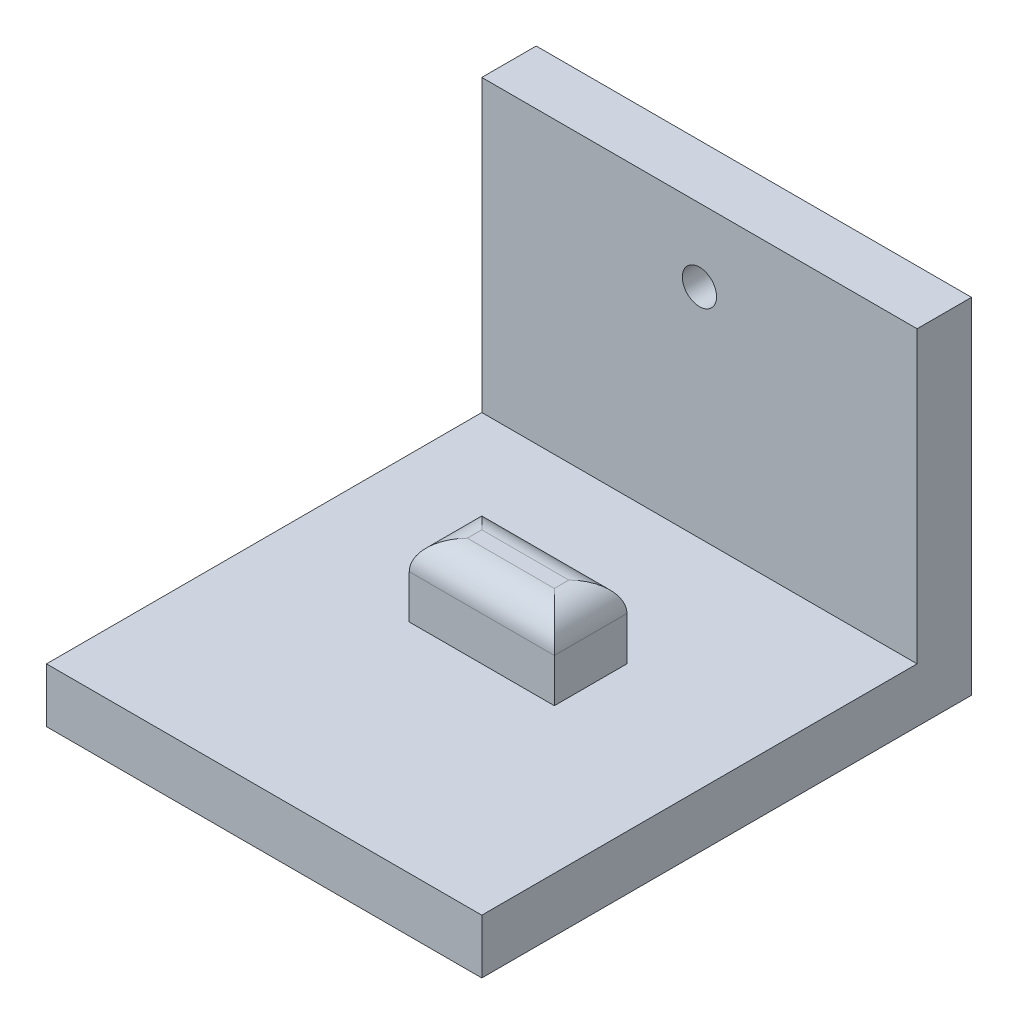
ISO-10303-21;
HEADER;
FILE_DESCRIPTION(('STEP AP214'),'2;1');
FILE_NAME('part.step','',(''),(''),'','','');
FILE_SCHEMA(('AUTOMOTIVE_DESIGN { 1 0 10303 214 1 1 1 1 }'));
ENDSEC;
DATA;
#1=APPLICATION_CONTEXT('core data for automotive mechanical design processes');
#2=APPLICATION_PROTOCOL_DEFINITION('international standard','automotive_design',2000,#1);
#3=PRODUCT_CONTEXT('',#1,'mechanical');
#4=PRODUCT('Part','Part','',(#3));
#5=PRODUCT_RELATED_PRODUCT_CATEGORY('part','',(#4));
#6=PRODUCT_DEFINITION_FORMATION('','',#4);
#7=PRODUCT_DEFINITION_CONTEXT('part definition',#1,'design');
#8=PRODUCT_DEFINITION('design','',#6,#7);
#9=PRODUCT_DEFINITION_SHAPE('','',#8);
#10=(LENGTH_UNIT() NAMED_UNIT(*) SI_UNIT(.MILLI.,.METRE.));
#11=(NAMED_UNIT(*) PLANE_ANGLE_UNIT() SI_UNIT($,.RADIAN.));
#12=(NAMED_UNIT(*) SI_UNIT($,.STERADIAN.) SOLID_ANGLE_UNIT());
#13=UNCERTAINTY_MEASURE_WITH_UNIT(LENGTH_MEASURE(1.E-05),#10,'distance_accuracy_value','');
#14=(GEOMETRIC_REPRESENTATION_CONTEXT(3) GLOBAL_UNCERTAINTY_ASSIGNED_CONTEXT((#13)) GLOBAL_UNIT_ASSIGNED_CONTEXT((#10,
#11,#12)) REPRESENTATION_CONTEXT('',''));
#15=CARTESIAN_POINT('',(0.,0.,0.));
#16=DIRECTION('',(0.,0.,1.));
#17=DIRECTION('',(1.,0.,0.));
#18=AXIS2_PLACEMENT_3D('',#15,#16,#17);
#19=CARTESIAN_POINT('',(38.1,4.7625,42.8625));
#20=DIRECTION('',(0.,-1.,0.));
#21=DIRECTION('',(0.,0.,-1.));
#22=AXIS2_PLACEMENT_3D('',#19,#20,#21);
#23=PLANE('',#22);
#24=DIRECTION('',(0.,0.,1.));
#25=VECTOR('',#24,1.);
#26=CARTESIAN_POINT('',(0.,4.7625,42.8625));
#27=LINE('',#26,#25);
#28=CARTESIAN_POINT('',(0.,4.7625,4.7625));
#29=VERTEX_POINT('',#28);
#30=CARTESIAN_POINT('',(0.,4.7625,42.8625));
#31=VERTEX_POINT('',#30);
#32=EDGE_CURVE('E200',#29,#31,#27,.T.);
#33=ORIENTED_EDGE('',*,*,#32,.T.);
#34=DIRECTION('',(-1.,0.,0.));
#35=VECTOR('',#34,1.);
#36=CARTESIAN_POINT('',(38.1,4.7625,42.8625));
#37=LINE('',#36,#35);
#38=CARTESIAN_POINT('',(38.1,4.7625,42.8625));
#39=VERTEX_POINT('',#38);
#40=EDGE_CURVE('E215',#39,#31,#37,.T.);
#41=ORIENTED_EDGE('',*,*,#40,.F.);
#42=DIRECTION('',(0.,0.,1.));
#43=VECTOR('',#42,1.);
#44=CARTESIAN_POINT('',(38.1,4.7625,42.8625));
#45=LINE('',#44,#43);
#46=CARTESIAN_POINT('',(38.1,4.7625,4.7625));
#47=VERTEX_POINT('',#46);
#48=EDGE_CURVE('E181',#47,#39,#45,.T.);
#49=ORIENTED_EDGE('',*,*,#48,.F.);
#50=DIRECTION('',(-1.,0.,0.));
#51=VECTOR('',#50,1.);
#52=CARTESIAN_POINT('',(38.1,4.7625,4.7625));
#53=LINE('',#52,#51);
#54=EDGE_CURVE('E219',#47,#29,#53,.T.);
#55=ORIENTED_EDGE('',*,*,#54,.T.);
#56=EDGE_LOOP('',(#33,#41,#49,#55));
#57=FACE_BOUND('',#56,.T.);
#58=DIRECTION('',(0.,0.,1.));
#59=VECTOR('',#58,1.);
#60=CARTESIAN_POINT('',(12.7,4.7625,23.8125));
#61=LINE('',#60,#59);
#62=CARTESIAN_POINT('',(12.7,4.7625,17.4625));
#63=VERTEX_POINT('',#62);
#64=CARTESIAN_POINT('',(12.7,4.7625,23.8125));
#65=VERTEX_POINT('',#64);
#66=EDGE_CURVE('E133',#63,#65,#61,.T.);
#67=ORIENTED_EDGE('',*,*,#66,.F.);
#68=DIRECTION('',(-1.,0.,0.));
#69=VECTOR('',#68,1.);
#70=CARTESIAN_POINT('',(12.7,4.7625,17.4625));
#71=LINE('',#70,#69);
#72=CARTESIAN_POINT('',(25.4,4.7625,17.4625));
#73=VERTEX_POINT('',#72);
#74=EDGE_CURVE('E141',#73,#63,#71,.T.);
#75=ORIENTED_EDGE('',*,*,#74,.F.);
#76=DIRECTION('',(0.,0.,-1.));
#77=VECTOR('',#76,1.);
#78=CARTESIAN_POINT('',(25.4,4.7625,23.8125));
#79=LINE('',#78,#77);
#80=CARTESIAN_POINT('',(25.4,4.7625,23.8125));
#81=VERTEX_POINT('',#80);
#82=EDGE_CURVE('E155',#81,#73,#79,.T.);
#83=ORIENTED_EDGE('',*,*,#82,.F.);
#84=DIRECTION('',(1.,0.,0.));
#85=VECTOR('',#84,1.);
#86=CARTESIAN_POINT('',(12.7,4.7625,23.8125));
#87=LINE('',#86,#85);
#88=EDGE_CURVE('E149',#65,#81,#87,.T.);
#89=ORIENTED_EDGE('',*,*,#88,.F.);
#90=EDGE_LOOP('',(#67,#75,#83,#89));
#91=FACE_BOUND('',#90,.T.);
#92=ADVANCED_FACE('F39',(#57,#91),#23,.F.);
#93=CARTESIAN_POINT('',(38.1,30.1625,0.));
#94=DIRECTION('',(0.,0.,1.));
#95=DIRECTION('',(0.,-1.,0.));
#96=AXIS2_PLACEMENT_3D('',#93,#94,#95);
#97=PLANE('',#96);
#98=CARTESIAN_POINT('',(19.05,23.8125,0.));
#99=DIRECTION('',(0.,0.,1.));
#100=DIRECTION('',(1.,0.,0.));
#101=AXIS2_PLACEMENT_3D('',#98,#99,#100);
#102=CIRCLE('',#101,1.499997);
#103=CARTESIAN_POINT('',(20.549997,23.8125,0.));
#104=VERTEX_POINT('',#103);
#105=EDGE_CURVE('E151',#104,#104,#102,.T.);
#106=ORIENTED_EDGE('',*,*,#105,.T.);
#107=EDGE_LOOP('',(#106));
#108=FACE_BOUND('',#107,.T.);
#109=DIRECTION('',(0.,1.,0.));
#110=VECTOR('',#109,1.);
#111=CARTESIAN_POINT('',(0.,30.1625,0.));
#112=LINE('',#111,#110);
#113=CARTESIAN_POINT('',(0.,0.,0.));
#114=VERTEX_POINT('',#113);
#115=CARTESIAN_POINT('',(0.,30.1625,0.));
#116=VERTEX_POINT('',#115);
#117=EDGE_CURVE('E169',#114,#116,#112,.T.);
#118=ORIENTED_EDGE('',*,*,#117,.T.);
#119=DIRECTION('',(-1.,0.,0.));
#120=VECTOR('',#119,1.);
#121=CARTESIAN_POINT('',(38.1,30.1625,0.));
#122=LINE('',#121,#120);
#123=CARTESIAN_POINT('',(38.1,30.1625,0.));
#124=VERTEX_POINT('',#123);
#125=EDGE_CURVE('E227',#124,#116,#122,.T.);
#126=ORIENTED_EDGE('',*,*,#125,.F.);
#127=DIRECTION('',(0.,1.,0.));
#128=VECTOR('',#127,1.);
#129=CARTESIAN_POINT('',(38.1,30.1625,0.));
#130=LINE('',#129,#128);
#131=CARTESIAN_POINT('',(38.1,0.,0.));
#132=VERTEX_POINT('',#131);
#133=EDGE_CURVE('E170',#132,#124,#130,.T.);
#134=ORIENTED_EDGE('',*,*,#133,.F.);
#135=DIRECTION('',(-1.,0.,0.));
#136=VECTOR('',#135,1.);
#137=CARTESIAN_POINT('',(38.1,0.,0.));
#138=LINE('',#137,#136);
#139=EDGE_CURVE('E190',#132,#114,#138,.T.);
#140=ORIENTED_EDGE('',*,*,#139,.T.);
#141=EDGE_LOOP('',(#118,#126,#134,#140));
#142=FACE_BOUND('',#141,.T.);
#143=ADVANCED_FACE('F297',(#108,#142),#97,.F.);
#144=CARTESIAN_POINT('',(38.1,30.1625,4.7625));
#145=DIRECTION('',(0.,-1.,0.));
#146=DIRECTION('',(0.,0.,-1.));
#147=AXIS2_PLACEMENT_3D('',#144,#145,#146);
#148=PLANE('',#147);
#149=DIRECTION('',(0.,0.,1.));
#150=VECTOR('',#149,1.);
#151=CARTESIAN_POINT('',(0.,30.1625,4.7625));
#152=LINE('',#151,#150);
#153=CARTESIAN_POINT('',(0.,30.1625,4.7625));
#154=VERTEX_POINT('',#153);
#155=EDGE_CURVE('E194',#116,#154,#152,.T.);
#156=ORIENTED_EDGE('',*,*,#155,.T.);
#157=DIRECTION('',(-1.,0.,0.));
#158=VECTOR('',#157,1.);
#159=CARTESIAN_POINT('',(38.1,30.1625,4.7625));
#160=LINE('',#159,#158);
#161=CARTESIAN_POINT('',(38.1,30.1625,4.7625));
#162=VERTEX_POINT('',#161);
#163=EDGE_CURVE('E223',#162,#154,#160,.T.);
#164=ORIENTED_EDGE('',*,*,#163,.F.);
#165=DIRECTION('',(0.,0.,1.));
#166=VECTOR('',#165,1.);
#167=CARTESIAN_POINT('',(38.1,30.1625,4.7625));
#168=LINE('',#167,#166);
#169=EDGE_CURVE('E174',#124,#162,#168,.T.);
#170=ORIENTED_EDGE('',*,*,#169,.F.);
#171=ORIENTED_EDGE('',*,*,#125,.T.);
#172=EDGE_LOOP('',(#156,#164,#170,#171));
#173=FACE_BOUND('',#172,.T.);
#174=ADVANCED_FACE('F303',(#173),#148,.F.);
#175=CARTESIAN_POINT('',(38.1,4.7625,4.7625));
#176=DIRECTION('',(0.,0.,-1.));
#177=DIRECTION('',(0.,1.,0.));
#178=AXIS2_PLACEMENT_3D('',#175,#176,#177);
#179=PLANE('',#178);
#180=CARTESIAN_POINT('',(19.05,23.8125,4.7625));
#181=DIRECTION('',(0.,0.,1.));
#182=DIRECTION('',(1.,0.,0.));
#183=AXIS2_PLACEMENT_3D('',#180,#181,#182);
#184=CIRCLE('',#183,1.499997);
#185=CARTESIAN_POINT('',(20.549997,23.8125,4.7625));
#186=VERTEX_POINT('',#185);
#187=EDGE_CURVE('E264',#186,#186,#184,.T.);
#188=ORIENTED_EDGE('',*,*,#187,.F.);
#189=EDGE_LOOP('',(#188));
#190=FACE_BOUND('',#189,.T.);
#191=DIRECTION('',(0.,-1.,0.));
#192=VECTOR('',#191,1.);
#193=CARTESIAN_POINT('',(0.,4.7625,4.7625));
#194=LINE('',#193,#192);
#195=EDGE_CURVE('E197',#154,#29,#194,.T.);
#196=ORIENTED_EDGE('',*,*,#195,.T.);
#197=ORIENTED_EDGE('',*,*,#54,.F.);
#198=DIRECTION('',(0.,-1.,0.));
#199=VECTOR('',#198,1.);
#200=CARTESIAN_POINT('',(38.1,4.7625,4.7625));
#201=LINE('',#200,#199);
#202=EDGE_CURVE('E178',#162,#47,#201,.T.);
#203=ORIENTED_EDGE('',*,*,#202,.F.);
#204=ORIENTED_EDGE('',*,*,#163,.T.);
#205=EDGE_LOOP('',(#196,#197,#203,#204));
#206=FACE_BOUND('',#205,.T.);
#207=ADVANCED_FACE('F310',(#190,#206),#179,.F.);
#208=CARTESIAN_POINT('',(38.1,0.,42.8625));
#209=DIRECTION('',(0.,0.,-1.));
#210=DIRECTION('',(-1.,0.,0.));
#211=AXIS2_PLACEMENT_3D('',#208,#209,#210);
#212=PLANE('',#211);
#213=DIRECTION('',(0.,-1.,0.));
#214=VECTOR('',#213,1.);
#215=CARTESIAN_POINT('',(0.,0.,42.8625));
#216=LINE('',#215,#214);
#217=CARTESIAN_POINT('',(0.,0.,42.8625));
#218=VERTEX_POINT('',#217);
#219=EDGE_CURVE('E203',#31,#218,#216,.T.);
#220=ORIENTED_EDGE('',*,*,#219,.T.);
#221=DIRECTION('',(-1.,0.,0.));
#222=VECTOR('',#221,1.);
#223=CARTESIAN_POINT('',(38.1,0.,42.8625));
#224=LINE('',#223,#222);
#225=CARTESIAN_POINT('',(38.1,0.,42.8625));
#226=VERTEX_POINT('',#225);
#227=EDGE_CURVE('E211',#226,#218,#224,.T.);
#228=ORIENTED_EDGE('',*,*,#227,.F.);
#229=DIRECTION('',(0.,-1.,0.));
#230=VECTOR('',#229,1.);
#231=CARTESIAN_POINT('',(38.1,0.,42.8625));
#232=LINE('',#231,#230);
#233=EDGE_CURVE('E184',#39,#226,#232,.T.);
#234=ORIENTED_EDGE('',*,*,#233,.F.);
#235=ORIENTED_EDGE('',*,*,#40,.T.);
#236=EDGE_LOOP('',(#220,#228,#234,#235));
#237=FACE_BOUND('',#236,.T.);
#238=ADVANCED_FACE('F308',(#237),#212,.F.);
#239=CARTESIAN_POINT('',(38.1,0.,0.));
#240=DIRECTION('',(0.,1.,0.));
#241=DIRECTION('',(0.,0.,1.));
#242=AXIS2_PLACEMENT_3D('',#239,#240,#241);
#243=PLANE('',#242);
#244=DIRECTION('',(0.,0.,-1.));
#245=VECTOR('',#244,1.);
#246=CARTESIAN_POINT('',(0.,0.,0.));
#247=LINE('',#246,#245);
#248=EDGE_CURVE('E175',#218,#114,#247,.T.);
#249=ORIENTED_EDGE('',*,*,#248,.T.);
#250=ORIENTED_EDGE('',*,*,#139,.F.);
#251=DIRECTION('',(0.,0.,-1.));
#252=VECTOR('',#251,1.);
#253=CARTESIAN_POINT('',(38.1,0.,0.));
#254=LINE('',#253,#252);
#255=EDGE_CURVE('E187',#226,#132,#254,.T.);
#256=ORIENTED_EDGE('',*,*,#255,.F.);
#257=ORIENTED_EDGE('',*,*,#227,.T.);
#258=EDGE_LOOP('',(#249,#250,#256,#257));
#259=FACE_BOUND('',#258,.T.);
#260=ADVANCED_FACE('F356',(#259),#243,.F.);
#261=CARTESIAN_POINT('',(38.1,0.,0.));
#262=DIRECTION('',(-1.,0.,0.));
#263=DIRECTION('',(0.,0.,1.));
#264=AXIS2_PLACEMENT_3D('',#261,#262,#263);
#265=PLANE('',#264);
#266=ORIENTED_EDGE('',*,*,#133,.T.);
#267=ORIENTED_EDGE('',*,*,#169,.T.);
#268=ORIENTED_EDGE('',*,*,#202,.T.);
#269=ORIENTED_EDGE('',*,*,#48,.T.);
#270=ORIENTED_EDGE('',*,*,#233,.T.);
#271=ORIENTED_EDGE('',*,*,#255,.T.);
#272=EDGE_LOOP('',(#266,#267,#268,#269,#270,#271));
#273=FACE_BOUND('',#272,.T.);
#274=ADVANCED_FACE('F351',(#273),#265,.F.);
#275=CARTESIAN_POINT('',(0.,0.,0.));
#276=DIRECTION('',(-1.,0.,0.));
#277=DIRECTION('',(0.,0.,1.));
#278=AXIS2_PLACEMENT_3D('',#275,#276,#277);
#279=PLANE('',#278);
#280=ORIENTED_EDGE('',*,*,#117,.F.);
#281=ORIENTED_EDGE('',*,*,#248,.F.);
#282=ORIENTED_EDGE('',*,*,#219,.F.);
#283=ORIENTED_EDGE('',*,*,#32,.F.);
#284=ORIENTED_EDGE('',*,*,#195,.F.);
#285=ORIENTED_EDGE('',*,*,#155,.F.);
#286=EDGE_LOOP('',(#280,#281,#282,#283,#284,#285));
#287=FACE_BOUND('',#286,.T.);
#288=ADVANCED_FACE('F344',(#287),#279,.T.);
#289=CARTESIAN_POINT('',(12.7,11.1125,23.8125));
#290=DIRECTION('',(1.,0.,0.));
#291=DIRECTION('',(0.,0.,-1.));
#292=AXIS2_PLACEMENT_3D('',#289,#290,#291);
#293=PLANE('',#292);
#294=DIRECTION('',(0.,-1.,0.));
#295=VECTOR('',#294,1.);
#296=CARTESIAN_POINT('',(12.7,11.1125,23.8125));
#297=LINE('',#296,#295);
#298=CARTESIAN_POINT('',(12.7,8.5725,23.8125));
#299=VERTEX_POINT('',#298);
#300=EDGE_CURVE('E166',#299,#65,#297,.T.);
#301=ORIENTED_EDGE('',*,*,#300,.F.);
#302=DIRECTION('',(0.,0.,1.));
#303=VECTOR('',#302,1.);
#304=CARTESIAN_POINT('',(12.7,8.5725,23.8125));
#305=LINE('',#304,#303);
#306=CARTESIAN_POINT('',(12.7,8.5725,17.4625));
#307=VERTEX_POINT('',#306);
#308=EDGE_CURVE('E11',#299,#307,#305,.F.);
#309=ORIENTED_EDGE('',*,*,#308,.T.);
#310=DIRECTION('',(0.,-1.,0.));
#311=VECTOR('',#310,1.);
#312=CARTESIAN_POINT('',(12.7,11.1125,17.4625));
#313=LINE('',#312,#311);
#314=EDGE_CURVE('E130',#307,#63,#313,.T.);
#315=ORIENTED_EDGE('',*,*,#314,.T.);
#316=ORIENTED_EDGE('',*,*,#66,.T.);
#317=EDGE_LOOP('',(#301,#309,#315,#316));
#318=FACE_BOUND('',#317,.T.);
#319=ADVANCED_FACE('F132',(#318),#293,.F.);
#320=CARTESIAN_POINT('',(12.7,11.1125,23.8125));
#321=DIRECTION('',(0.,0.,-1.));
#322=DIRECTION('',(0.,1.,0.));
#323=AXIS2_PLACEMENT_3D('',#320,#321,#322);
#324=PLANE('',#323);
#325=DIRECTION('',(0.,-1.,0.));
#326=VECTOR('',#325,1.);
#327=CARTESIAN_POINT('',(25.4,11.1125,23.8125));
#328=LINE('',#327,#326);
#329=CARTESIAN_POINT('',(25.4,8.5725,23.8125));
#330=VERTEX_POINT('',#329);
#331=EDGE_CURVE('E163',#330,#81,#328,.T.);
#332=ORIENTED_EDGE('',*,*,#331,.F.);
#333=DIRECTION('',(1.,0.,0.));
#334=VECTOR('',#333,1.);
#335=CARTESIAN_POINT('',(12.7,8.5725,23.8125));
#336=LINE('',#335,#334);
#337=EDGE_CURVE('E49',#330,#299,#336,.F.);
#338=ORIENTED_EDGE('',*,*,#337,.T.);
#339=ORIENTED_EDGE('',*,*,#300,.T.);
#340=ORIENTED_EDGE('',*,*,#88,.T.);
#341=EDGE_LOOP('',(#332,#338,#339,#340));
#342=FACE_BOUND('',#341,.T.);
#343=ADVANCED_FACE('F277',(#342),#324,.F.);
#344=CARTESIAN_POINT('',(25.4,11.1125,23.8125));
#345=DIRECTION('',(-1.,0.,0.));
#346=DIRECTION('',(0.,0.,1.));
#347=AXIS2_PLACEMENT_3D('',#344,#345,#346);
#348=PLANE('',#347);
#349=DIRECTION('',(0.,-1.,0.));
#350=VECTOR('',#349,1.);
#351=CARTESIAN_POINT('',(25.4,11.1125,17.4625));
#352=LINE('',#351,#350);
#353=CARTESIAN_POINT('',(25.4,8.5725,17.4625));
#354=VERTEX_POINT('',#353);
#355=EDGE_CURVE('E140',#354,#73,#352,.T.);
#356=ORIENTED_EDGE('',*,*,#355,.F.);
#357=DIRECTION('',(0.,0.,-1.));
#358=VECTOR('',#357,1.);
#359=CARTESIAN_POINT('',(25.4,8.5725,23.8125));
#360=LINE('',#359,#358);
#361=EDGE_CURVE('E64',#354,#330,#360,.F.);
#362=ORIENTED_EDGE('',*,*,#361,.T.);
#363=ORIENTED_EDGE('',*,*,#331,.T.);
#364=ORIENTED_EDGE('',*,*,#82,.T.);
#365=EDGE_LOOP('',(#356,#362,#363,#364));
#366=FACE_BOUND('',#365,.T.);
#367=ADVANCED_FACE('F286',(#366),#348,.F.);
#368=CARTESIAN_POINT('',(12.7,11.1125,17.4625));
#369=DIRECTION('',(0.,0.,1.));
#370=DIRECTION('',(0.,-1.,0.));
#371=AXIS2_PLACEMENT_3D('',#368,#369,#370);
#372=PLANE('',#371);
#373=ORIENTED_EDGE('',*,*,#314,.F.);
#374=DIRECTION('',(-1.,0.,0.));
#375=VECTOR('',#374,1.);
#376=CARTESIAN_POINT('',(12.7,8.5725,17.4625));
#377=LINE('',#376,#375);
#378=EDGE_CURVE('E244',#307,#354,#377,.F.);
#379=ORIENTED_EDGE('',*,*,#378,.T.);
#380=ORIENTED_EDGE('',*,*,#355,.T.);
#381=ORIENTED_EDGE('',*,*,#74,.T.);
#382=EDGE_LOOP('',(#373,#379,#380,#381));
#383=FACE_BOUND('',#382,.T.);
#384=ADVANCED_FACE('F153',(#383),#372,.F.);
#385=CARTESIAN_POINT('',(0.,11.1125,0.));
#386=DIRECTION('',(0.,-1.,0.));
#387=DIRECTION('',(0.,0.,-1.));
#388=AXIS2_PLACEMENT_3D('',#385,#386,#387);
#389=PLANE('',#388);
#390=DIRECTION('',(0.,0.,-1.));
#391=VECTOR('',#390,1.);
#392=CARTESIAN_POINT('',(22.86,11.1125,0.));
#393=LINE('',#392,#391);
#394=CARTESIAN_POINT('',(22.86,11.1125,21.2725));
#395=VERTEX_POINT('',#394);
#396=CARTESIAN_POINT('',(22.86,11.1125,20.0025));
#397=VERTEX_POINT('',#396);
#398=EDGE_CURVE('E237',#395,#397,#393,.T.);
#399=ORIENTED_EDGE('',*,*,#398,.T.);
#400=DIRECTION('',(-1.,0.,0.));
#401=VECTOR('',#400,1.);
#402=CARTESIAN_POINT('',(0.,11.1125,20.0025));
#403=LINE('',#402,#401);
#404=CARTESIAN_POINT('',(15.24,11.1125,20.0025));
#405=VERTEX_POINT('',#404);
#406=EDGE_CURVE('E240',#397,#405,#403,.T.);
#407=ORIENTED_EDGE('',*,*,#406,.T.);
#408=DIRECTION('',(0.,0.,1.));
#409=VECTOR('',#408,1.);
#410=CARTESIAN_POINT('',(15.24,11.1125,0.));
#411=LINE('',#410,#409);
#412=CARTESIAN_POINT('',(15.24,11.1125,21.2725));
#413=VERTEX_POINT('',#412);
#414=EDGE_CURVE('E231',#405,#413,#411,.T.);
#415=ORIENTED_EDGE('',*,*,#414,.T.);
#416=DIRECTION('',(1.,0.,0.));
#417=VECTOR('',#416,1.);
#418=CARTESIAN_POINT('',(0.,11.1125,21.2725));
#419=LINE('',#418,#417);
#420=EDGE_CURVE('E234',#413,#395,#419,.T.);
#421=ORIENTED_EDGE('',*,*,#420,.T.);
#422=EDGE_LOOP('',(#399,#407,#415,#421));
#423=FACE_BOUND('',#422,.T.);
#424=ADVANCED_FACE('F293',(#423),#389,.F.);
#425=CARTESIAN_POINT('',(19.05,23.8125,0.));
#426=DIRECTION('',(0.,0.,1.));
#427=DIRECTION('',(1.,0.,0.));
#428=AXIS2_PLACEMENT_3D('',#425,#426,#427);
#429=CYLINDRICAL_SURFACE('',#428,1.499997);
#430=ORIENTED_EDGE('',*,*,#105,.F.);
#431=EDGE_LOOP('',(#430));
#432=FACE_BOUND('',#431,.T.);
#433=ORIENTED_EDGE('',*,*,#187,.T.);
#434=EDGE_LOOP('',(#433));
#435=FACE_BOUND('',#434,.T.);
#436=ADVANCED_FACE('F325',(#432,#435),#429,.F.);
#437=CARTESIAN_POINT('',(0.,8.5725,21.2725));
#438=DIRECTION('',(1.,0.,0.));
#439=DIRECTION('',(0.,0.,-1.));
#440=AXIS2_PLACEMENT_3D('',#437,#438,#439);
#441=CYLINDRICAL_SURFACE('',#440,2.54);
#442=CARTESIAN_POINT('',(15.24,8.5725,21.2725));
#443=DIRECTION('',(0.707106781186547,0.,0.707106781186547));
#444=DIRECTION('',(-0.707106781186547,0.,0.707106781186547));
#445=AXIS2_PLACEMENT_3D('',#442,#443,#444);
#446=ELLIPSE('',#445,3.59210244842766,2.54);
#447=EDGE_CURVE('E256',#299,#413,#446,.F.);
#448=ORIENTED_EDGE('',*,*,#447,.F.);
#449=ORIENTED_EDGE('',*,*,#337,.F.);
#450=CARTESIAN_POINT('',(22.86,8.5725,21.2725));
#451=DIRECTION('',(0.707106781186547,0.,-0.707106781186547));
#452=DIRECTION('',(0.707106781186547,0.,0.707106781186547));
#453=AXIS2_PLACEMENT_3D('',#450,#451,#452);
#454=ELLIPSE('',#453,3.59210244842766,2.54);
#455=EDGE_CURVE('E43',#395,#330,#454,.T.);
#456=ORIENTED_EDGE('',*,*,#455,.F.);
#457=ORIENTED_EDGE('',*,*,#420,.F.);
#458=EDGE_LOOP('',(#448,#449,#456,#457));
#459=FACE_BOUND('',#458,.T.);
#460=ADVANCED_FACE('F41',(#459),#441,.T.);
#461=CARTESIAN_POINT('',(22.86,8.5725,0.));
#462=DIRECTION('',(0.,0.,-1.));
#463=DIRECTION('',(-1.,0.,0.));
#464=AXIS2_PLACEMENT_3D('',#461,#462,#463);
#465=CYLINDRICAL_SURFACE('',#464,2.54);
#466=ORIENTED_EDGE('',*,*,#455,.T.);
#467=ORIENTED_EDGE('',*,*,#361,.F.);
#468=CARTESIAN_POINT('',(22.86,8.5725,20.0025));
#469=DIRECTION('',(-0.707106781186547,0.,-0.707106781186547));
#470=DIRECTION('',(0.707106781186547,0.,-0.707106781186547));
#471=AXIS2_PLACEMENT_3D('',#468,#469,#470);
#472=ELLIPSE('',#471,3.59210244842766,2.54);
#473=EDGE_CURVE('E254',#397,#354,#472,.T.);
#474=ORIENTED_EDGE('',*,*,#473,.F.);
#475=ORIENTED_EDGE('',*,*,#398,.F.);
#476=EDGE_LOOP('',(#466,#467,#474,#475));
#477=FACE_BOUND('',#476,.T.);
#478=ADVANCED_FACE('F320',(#477),#465,.T.);
#479=CARTESIAN_POINT('',(15.24,8.5725,0.));
#480=DIRECTION('',(0.,0.,1.));
#481=DIRECTION('',(1.,0.,0.));
#482=AXIS2_PLACEMENT_3D('',#479,#480,#481);
#483=CYLINDRICAL_SURFACE('',#482,2.54);
#484=ORIENTED_EDGE('',*,*,#447,.T.);
#485=ORIENTED_EDGE('',*,*,#414,.F.);
#486=CARTESIAN_POINT('',(15.24,8.5725,20.0025));
#487=DIRECTION('',(-0.707106781186547,0.,0.707106781186547));
#488=DIRECTION('',(0.707106781186547,0.,0.707106781186547));
#489=AXIS2_PLACEMENT_3D('',#486,#487,#488);
#490=ELLIPSE('',#489,3.59210244842766,2.54);
#491=EDGE_CURVE('E251',#307,#405,#490,.F.);
#492=ORIENTED_EDGE('',*,*,#491,.F.);
#493=ORIENTED_EDGE('',*,*,#308,.F.);
#494=EDGE_LOOP('',(#484,#485,#492,#493));
#495=FACE_BOUND('',#494,.T.);
#496=ADVANCED_FACE('F281',(#495),#483,.T.);
#497=CARTESIAN_POINT('',(0.,8.5725,20.0025));
#498=DIRECTION('',(-1.,0.,0.));
#499=DIRECTION('',(0.,0.,1.));
#500=AXIS2_PLACEMENT_3D('',#497,#498,#499);
#501=CYLINDRICAL_SURFACE('',#500,2.54);
#502=ORIENTED_EDGE('',*,*,#473,.T.);
#503=ORIENTED_EDGE('',*,*,#378,.F.);
#504=ORIENTED_EDGE('',*,*,#491,.T.);
#505=ORIENTED_EDGE('',*,*,#406,.F.);
#506=EDGE_LOOP('',(#502,#503,#504,#505));
#507=FACE_BOUND('',#506,.T.);
#508=ADVANCED_FACE('F284',(#507),#501,.T.);
#509=CLOSED_SHELL('',(#92,#143,#174,#207,#238,#260,#274,#288,#319,#343,#367,#384,#424,#436,#460,
#478,#496,#508));
#510=MANIFOLD_SOLID_BREP('B2',#509);
#511=ADVANCED_BREP_SHAPE_REPRESENTATION('',(#18,#510),#14);
#512=SHAPE_DEFINITION_REPRESENTATION(#9,#511);
ENDSEC;
END-ISO-10303-21;
